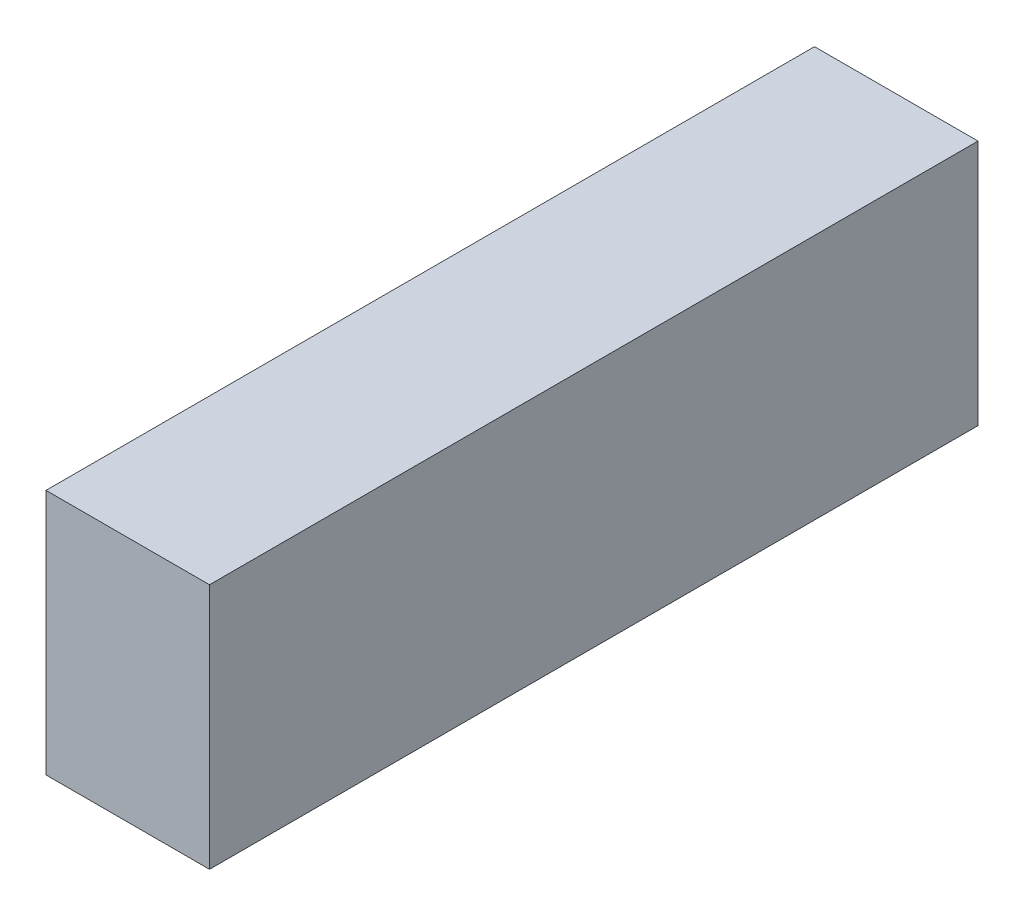
ISO-10303-21;
HEADER;
FILE_DESCRIPTION(('STEP AP214'),'2;1');
FILE_NAME('part.step','',(''),(''),'','','');
FILE_SCHEMA(('AUTOMOTIVE_DESIGN { 1 0 10303 214 1 1 1 1 }'));
ENDSEC;
DATA;
#1=APPLICATION_CONTEXT('core data for automotive mechanical design processes');
#2=APPLICATION_PROTOCOL_DEFINITION('international standard','automotive_design',2000,#1);
#3=PRODUCT_CONTEXT('',#1,'mechanical');
#4=PRODUCT('Part','Part','',(#3));
#5=PRODUCT_RELATED_PRODUCT_CATEGORY('part','',(#4));
#6=PRODUCT_DEFINITION_FORMATION('','',#4);
#7=PRODUCT_DEFINITION_CONTEXT('part definition',#1,'design');
#8=PRODUCT_DEFINITION('design','',#6,#7);
#9=PRODUCT_DEFINITION_SHAPE('','',#8);
#10=(LENGTH_UNIT() NAMED_UNIT(*) SI_UNIT(.MILLI.,.METRE.));
#11=(NAMED_UNIT(*) PLANE_ANGLE_UNIT() SI_UNIT($,.RADIAN.));
#12=(NAMED_UNIT(*) SI_UNIT($,.STERADIAN.) SOLID_ANGLE_UNIT());
#13=UNCERTAINTY_MEASURE_WITH_UNIT(LENGTH_MEASURE(1.E-05),#10,'distance_accuracy_value','');
#14=(GEOMETRIC_REPRESENTATION_CONTEXT(3) GLOBAL_UNCERTAINTY_ASSIGNED_CONTEXT((#13)) GLOBAL_UNIT_ASSIGNED_CONTEXT((#10,
#11,#12)) REPRESENTATION_CONTEXT('',''));
#15=CARTESIAN_POINT('',(0.,0.,0.));
#16=DIRECTION('',(0.,0.,1.));
#17=DIRECTION('',(1.,0.,0.));
#18=AXIS2_PLACEMENT_3D('',#15,#16,#17);
#19=CARTESIAN_POINT('',(-3.180178224746,-5.977969005857,-5.5));
#20=DIRECTION('',(0.,0.,1.));
#21=DIRECTION('',(0.,-1.,0.));
#22=AXIS2_PLACEMENT_3D('',#19,#20,#21);
#23=PLANE('',#22);
#24=DIRECTION('',(-1.,0.,0.));
#25=VECTOR('',#24,1.);
#26=CARTESIAN_POINT('',(-3.073800202523,-5.817614572523,-5.5));
#27=LINE('',#26,#25);
#28=CARTESIAN_POINT('',(-3.073800202523,-5.817614572523,-5.5));
#29=VERTEX_POINT('',#28);
#30=CARTESIAN_POINT('',(-3.286556246968,-5.817614572523,-5.5));
#31=VERTEX_POINT('',#30);
#32=EDGE_CURVE('E79',#29,#31,#27,.T.);
#33=ORIENTED_EDGE('',*,*,#32,.T.);
#34=DIRECTION('',(0.,-1.,0.));
#35=VECTOR('',#34,1.);
#36=CARTESIAN_POINT('',(-3.286556246968,-5.817614572523,-5.5));
#37=LINE('',#36,#35);
#38=CARTESIAN_POINT('',(-3.286556246968,-6.13832343919,-5.5));
#39=VERTEX_POINT('',#38);
#40=EDGE_CURVE('E77',#31,#39,#37,.T.);
#41=ORIENTED_EDGE('',*,*,#40,.T.);
#42=DIRECTION('',(1.,0.,0.));
#43=VECTOR('',#42,1.);
#44=CARTESIAN_POINT('',(-3.286556246968,-6.13832343919,-5.5));
#45=LINE('',#44,#43);
#46=CARTESIAN_POINT('',(-3.073800202523,-6.13832343919,-5.5));
#47=VERTEX_POINT('',#46);
#48=EDGE_CURVE('E65',#39,#47,#45,.T.);
#49=ORIENTED_EDGE('',*,*,#48,.T.);
#50=DIRECTION('',(0.,1.,0.));
#51=VECTOR('',#50,1.);
#52=CARTESIAN_POINT('',(-3.073800202523,-6.13832343919,-5.5));
#53=LINE('',#52,#51);
#54=EDGE_CURVE('E11',#47,#29,#53,.T.);
#55=ORIENTED_EDGE('',*,*,#54,.T.);
#56=EDGE_LOOP('',(#33,#41,#49,#55));
#57=FACE_BOUND('',#56,.T.);
#58=ADVANCED_FACE('F16',(#57),#23,.T.);
#59=CARTESIAN_POINT('',(-3.180178224746,-5.977969005857,-6.5));
#60=DIRECTION('',(0.,0.,1.));
#61=DIRECTION('',(0.,-1.,0.));
#62=AXIS2_PLACEMENT_3D('',#59,#60,#61);
#63=PLANE('',#62);
#64=DIRECTION('',(-1.,0.,0.));
#65=VECTOR('',#64,1.);
#66=CARTESIAN_POINT('',(-3.073800202523,-5.817614572523,-6.5));
#67=LINE('',#66,#65);
#68=CARTESIAN_POINT('',(-3.073800202523,-5.817614572523,-6.5));
#69=VERTEX_POINT('',#68);
#70=CARTESIAN_POINT('',(-3.286556246968,-5.817614572523,-6.5));
#71=VERTEX_POINT('',#70);
#72=EDGE_CURVE('E96',#69,#71,#67,.T.);
#73=ORIENTED_EDGE('',*,*,#72,.F.);
#74=DIRECTION('',(0.,1.,0.));
#75=VECTOR('',#74,1.);
#76=CARTESIAN_POINT('',(-3.073800202523,-6.13832343919,-6.5));
#77=LINE('',#76,#75);
#78=CARTESIAN_POINT('',(-3.073800202523,-6.13832343919,-6.5));
#79=VERTEX_POINT('',#78);
#80=EDGE_CURVE('E27',#79,#69,#77,.T.);
#81=ORIENTED_EDGE('',*,*,#80,.F.);
#82=DIRECTION('',(1.,0.,0.));
#83=VECTOR('',#82,1.);
#84=CARTESIAN_POINT('',(-3.286556246968,-6.13832343919,-6.5));
#85=LINE('',#84,#83);
#86=CARTESIAN_POINT('',(-3.286556246968,-6.13832343919,-6.5));
#87=VERTEX_POINT('',#86);
#88=EDGE_CURVE('E84',#87,#79,#85,.T.);
#89=ORIENTED_EDGE('',*,*,#88,.F.);
#90=DIRECTION('',(0.,-1.,0.));
#91=VECTOR('',#90,1.);
#92=CARTESIAN_POINT('',(-3.286556246968,-5.817614572523,-6.5));
#93=LINE('',#92,#91);
#94=EDGE_CURVE('E85',#71,#87,#93,.T.);
#95=ORIENTED_EDGE('',*,*,#94,.F.);
#96=EDGE_LOOP('',(#73,#81,#89,#95));
#97=FACE_BOUND('',#96,.T.);
#98=ADVANCED_FACE('F113',(#97),#63,.F.);
#99=CARTESIAN_POINT('',(-3.073800202523,-5.9779690058565,-5.49));
#100=DIRECTION('',(-1.,0.,0.));
#101=DIRECTION('',(0.,1.,0.));
#102=AXIS2_PLACEMENT_3D('',#99,#100,#101);
#103=PLANE('',#102);
#104=DIRECTION('',(0.,0.,1.));
#105=VECTOR('',#104,1.);
#106=CARTESIAN_POINT('',(-3.073800202523,-6.13832343919,-6.5));
#107=LINE('',#106,#105);
#108=EDGE_CURVE('E71',#79,#47,#107,.T.);
#109=ORIENTED_EDGE('',*,*,#108,.F.);
#110=ORIENTED_EDGE('',*,*,#80,.T.);
#111=DIRECTION('',(0.,0.,1.));
#112=VECTOR('',#111,1.);
#113=CARTESIAN_POINT('',(-3.073800202523,-5.817614572523,-6.5));
#114=LINE('',#113,#112);
#115=EDGE_CURVE('E100',#69,#29,#114,.T.);
#116=ORIENTED_EDGE('',*,*,#115,.T.);
#117=ORIENTED_EDGE('',*,*,#54,.F.);
#118=EDGE_LOOP('',(#109,#110,#116,#117));
#119=FACE_BOUND('',#118,.T.);
#120=ADVANCED_FACE('F115',(#119),#103,.F.);
#121=CARTESIAN_POINT('',(-3.1801782247455,-6.13832343919,-5.49));
#122=DIRECTION('',(0.,1.,0.));
#123=DIRECTION('',(-1.,0.,0.));
#124=AXIS2_PLACEMENT_3D('',#121,#122,#123);
#125=PLANE('',#124);
#126=DIRECTION('',(0.,0.,1.));
#127=VECTOR('',#126,1.);
#128=CARTESIAN_POINT('',(-3.286556246968,-6.13832343919,-6.5));
#129=LINE('',#128,#127);
#130=EDGE_CURVE('E20',#87,#39,#129,.T.);
#131=ORIENTED_EDGE('',*,*,#130,.F.);
#132=ORIENTED_EDGE('',*,*,#88,.T.);
#133=ORIENTED_EDGE('',*,*,#108,.T.);
#134=ORIENTED_EDGE('',*,*,#48,.F.);
#135=EDGE_LOOP('',(#131,#132,#133,#134));
#136=FACE_BOUND('',#135,.T.);
#137=ADVANCED_FACE('F67',(#136),#125,.F.);
#138=CARTESIAN_POINT('',(-3.286556246968,-5.9779690058565,-5.49));
#139=DIRECTION('',(1.,0.,0.));
#140=DIRECTION('',(0.,0.,-1.));
#141=AXIS2_PLACEMENT_3D('',#138,#139,#140);
#142=PLANE('',#141);
#143=DIRECTION('',(0.,0.,1.));
#144=VECTOR('',#143,1.);
#145=CARTESIAN_POINT('',(-3.286556246968,-5.817614572523,-6.5));
#146=LINE('',#145,#144);
#147=EDGE_CURVE('E93',#71,#31,#146,.T.);
#148=ORIENTED_EDGE('',*,*,#147,.F.);
#149=ORIENTED_EDGE('',*,*,#94,.T.);
#150=ORIENTED_EDGE('',*,*,#130,.T.);
#151=ORIENTED_EDGE('',*,*,#40,.F.);
#152=EDGE_LOOP('',(#148,#149,#150,#151));
#153=FACE_BOUND('',#152,.T.);
#154=ADVANCED_FACE('F18',(#153),#142,.F.);
#155=CARTESIAN_POINT('',(-3.1801782247455,-5.817614572523,-5.49));
#156=DIRECTION('',(0.,-1.,0.));
#157=DIRECTION('',(0.,0.,1.));
#158=AXIS2_PLACEMENT_3D('',#155,#156,#157);
#159=PLANE('',#158);
#160=ORIENTED_EDGE('',*,*,#115,.F.);
#161=ORIENTED_EDGE('',*,*,#72,.T.);
#162=ORIENTED_EDGE('',*,*,#147,.T.);
#163=ORIENTED_EDGE('',*,*,#32,.F.);
#164=EDGE_LOOP('',(#160,#161,#162,#163));
#165=FACE_BOUND('',#164,.T.);
#166=ADVANCED_FACE('F129',(#165),#159,.F.);
#167=CLOSED_SHELL('',(#58,#98,#120,#137,#154,#166));
#168=MANIFOLD_SOLID_BREP('B1',#167);
#169=ADVANCED_BREP_SHAPE_REPRESENTATION('',(#18,#168),#14);
#170=SHAPE_DEFINITION_REPRESENTATION(#9,#169);
ENDSEC;
END-ISO-10303-21;
